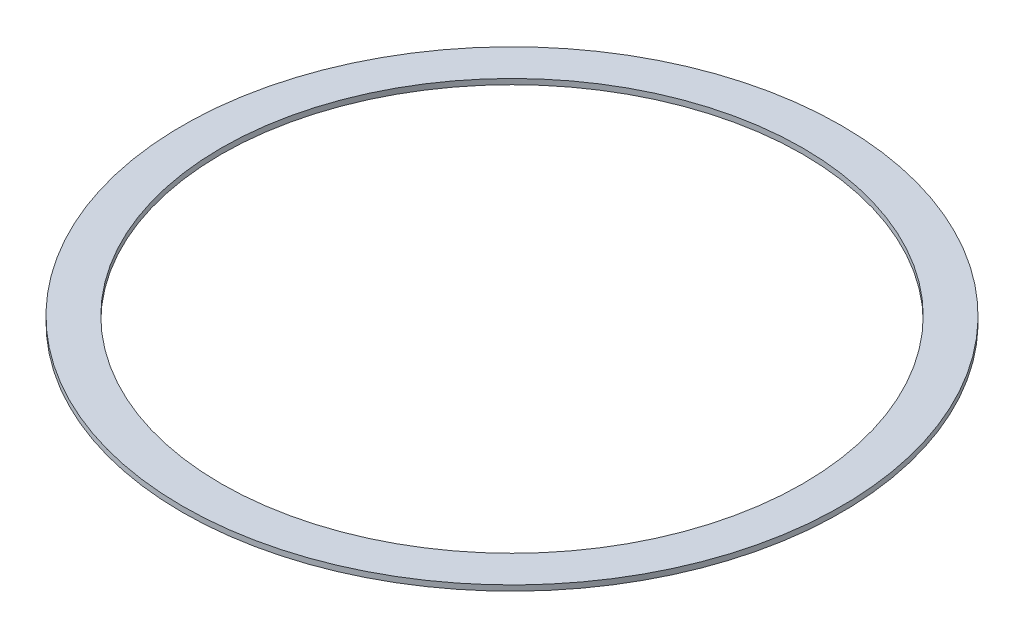
ISO-10303-21;
HEADER;
FILE_DESCRIPTION(('STEP AP214'),'2;1');
FILE_NAME('part.step','',(''),(''),'','','');
FILE_SCHEMA(('AUTOMOTIVE_DESIGN { 1 0 10303 214 1 1 1 1 }'));
ENDSEC;
DATA;
#1=APPLICATION_CONTEXT('core data for automotive mechanical design processes');
#2=APPLICATION_PROTOCOL_DEFINITION('international standard','automotive_design',2000,#1);
#3=PRODUCT_CONTEXT('',#1,'mechanical');
#4=PRODUCT('Part','Part','',(#3));
#5=PRODUCT_RELATED_PRODUCT_CATEGORY('part','',(#4));
#6=PRODUCT_DEFINITION_FORMATION('','',#4);
#7=PRODUCT_DEFINITION_CONTEXT('part definition',#1,'design');
#8=PRODUCT_DEFINITION('design','',#6,#7);
#9=PRODUCT_DEFINITION_SHAPE('','',#8);
#10=(LENGTH_UNIT() NAMED_UNIT(*) SI_UNIT(.MILLI.,.METRE.));
#11=(NAMED_UNIT(*) PLANE_ANGLE_UNIT() SI_UNIT($,.RADIAN.));
#12=(NAMED_UNIT(*) SI_UNIT($,.STERADIAN.) SOLID_ANGLE_UNIT());
#13=UNCERTAINTY_MEASURE_WITH_UNIT(LENGTH_MEASURE(1.E-05),#10,'distance_accuracy_value','');
#14=(GEOMETRIC_REPRESENTATION_CONTEXT(3) GLOBAL_UNCERTAINTY_ASSIGNED_CONTEXT((#13)) GLOBAL_UNIT_ASSIGNED_CONTEXT((#10,
#11,#12)) REPRESENTATION_CONTEXT('',''));
#15=CARTESIAN_POINT('',(0.,0.,0.));
#16=DIRECTION('',(0.,0.,1.));
#17=DIRECTION('',(1.,0.,0.));
#18=AXIS2_PLACEMENT_3D('',#15,#16,#17);
#19=CARTESIAN_POINT('',(0.,0.7,0.));
#20=DIRECTION('',(0.,1.,0.));
#21=DIRECTION('',(0.,0.,1.));
#22=AXIS2_PLACEMENT_3D('',#19,#20,#21);
#23=PLANE('',#22);
#24=CARTESIAN_POINT('',(0.,0.7,0.));
#25=DIRECTION('',(0.,1.,0.));
#26=DIRECTION('',(0.,0.,1.));
#27=AXIS2_PLACEMENT_3D('',#24,#25,#26);
#28=CIRCLE('',#27,42.5);
#29=CARTESIAN_POINT('',(0.,0.7,42.5));
#30=VERTEX_POINT('',#29);
#31=EDGE_CURVE('E10',#30,#30,#28,.T.);
#32=ORIENTED_EDGE('',*,*,#31,.T.);
#33=EDGE_LOOP('',(#32));
#34=FACE_BOUND('',#33,.T.);
#35=CARTESIAN_POINT('',(0.,0.7,0.));
#36=DIRECTION('',(0.,1.,0.));
#37=DIRECTION('',(0.,0.,1.));
#38=AXIS2_PLACEMENT_3D('',#35,#36,#37);
#39=CIRCLE('',#38,37.5);
#40=CARTESIAN_POINT('',(0.,0.7,37.5));
#41=VERTEX_POINT('',#40);
#42=EDGE_CURVE('E56',#41,#41,#39,.T.);
#43=ORIENTED_EDGE('',*,*,#42,.F.);
#44=EDGE_LOOP('',(#43));
#45=FACE_BOUND('',#44,.T.);
#46=ADVANCED_FACE('F43',(#34,#45),#23,.T.);
#47=CARTESIAN_POINT('',(0.,0.,0.));
#48=DIRECTION('',(0.,1.,0.));
#49=DIRECTION('',(0.,0.,1.));
#50=AXIS2_PLACEMENT_3D('',#47,#48,#49);
#51=PLANE('',#50);
#52=CARTESIAN_POINT('',(0.,0.,0.));
#53=DIRECTION('',(0.,1.,0.));
#54=DIRECTION('',(0.,0.,1.));
#55=AXIS2_PLACEMENT_3D('',#52,#53,#54);
#56=CIRCLE('',#55,42.5);
#57=CARTESIAN_POINT('',(0.,0.,42.5));
#58=VERTEX_POINT('',#57);
#59=EDGE_CURVE('E47',#58,#58,#56,.T.);
#60=ORIENTED_EDGE('',*,*,#59,.F.);
#61=EDGE_LOOP('',(#60));
#62=FACE_BOUND('',#61,.T.);
#63=CARTESIAN_POINT('',(0.,0.,0.));
#64=DIRECTION('',(0.,1.,0.));
#65=DIRECTION('',(0.,0.,1.));
#66=AXIS2_PLACEMENT_3D('',#63,#64,#65);
#67=CIRCLE('',#66,37.5);
#68=CARTESIAN_POINT('',(0.,0.,37.5));
#69=VERTEX_POINT('',#68);
#70=EDGE_CURVE('E58',#69,#69,#67,.T.);
#71=ORIENTED_EDGE('',*,*,#70,.T.);
#72=EDGE_LOOP('',(#71));
#73=FACE_BOUND('',#72,.T.);
#74=ADVANCED_FACE('F70',(#62,#73),#51,.F.);
#75=CARTESIAN_POINT('',(0.,0.7,0.));
#76=DIRECTION('',(0.,-1.,0.));
#77=DIRECTION('',(0.,0.,-1.));
#78=AXIS2_PLACEMENT_3D('',#75,#76,#77);
#79=CYLINDRICAL_SURFACE('',#78,42.5);
#80=ORIENTED_EDGE('',*,*,#31,.F.);
#81=EDGE_LOOP('',(#80));
#82=FACE_BOUND('',#81,.T.);
#83=ORIENTED_EDGE('',*,*,#59,.T.);
#84=EDGE_LOOP('',(#83));
#85=FACE_BOUND('',#84,.T.);
#86=ADVANCED_FACE('F45',(#82,#85),#79,.T.);
#87=CARTESIAN_POINT('',(0.,0.7,0.));
#88=DIRECTION('',(0.,-1.,0.));
#89=DIRECTION('',(0.,0.,-1.));
#90=AXIS2_PLACEMENT_3D('',#87,#88,#89);
#91=CYLINDRICAL_SURFACE('',#90,37.5);
#92=ORIENTED_EDGE('',*,*,#42,.T.);
#93=EDGE_LOOP('',(#92));
#94=FACE_BOUND('',#93,.T.);
#95=ORIENTED_EDGE('',*,*,#70,.F.);
#96=EDGE_LOOP('',(#95));
#97=FACE_BOUND('',#96,.T.);
#98=ADVANCED_FACE('F66',(#94,#97),#91,.F.);
#99=CLOSED_SHELL('',(#46,#74,#86,#98));
#100=MANIFOLD_SOLID_BREP('B2',#99);
#101=ADVANCED_BREP_SHAPE_REPRESENTATION('',(#18,#100),#14);
#102=SHAPE_DEFINITION_REPRESENTATION(#9,#101);
ENDSEC;
END-ISO-10303-21;
